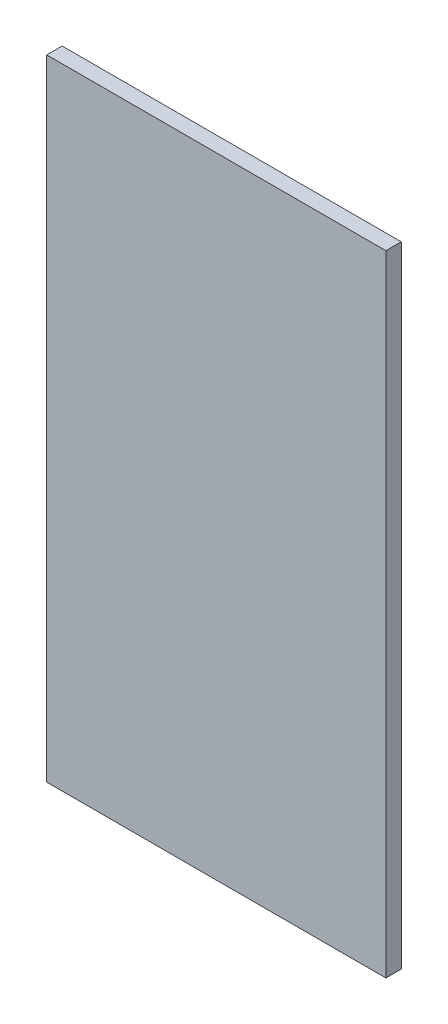
ISO-10303-21;
HEADER;
FILE_DESCRIPTION(('STEP AP214'),'2;1');
FILE_NAME('part.step','',(''),(''),'','','');
FILE_SCHEMA(('AUTOMOTIVE_DESIGN { 1 0 10303 214 1 1 1 1 }'));
ENDSEC;
DATA;
#1=APPLICATION_CONTEXT('core data for automotive mechanical design processes');
#2=APPLICATION_PROTOCOL_DEFINITION('international standard','automotive_design',2000,#1);
#3=PRODUCT_CONTEXT('',#1,'mechanical');
#4=PRODUCT('Part','Part','',(#3));
#5=PRODUCT_RELATED_PRODUCT_CATEGORY('part','',(#4));
#6=PRODUCT_DEFINITION_FORMATION('','',#4);
#7=PRODUCT_DEFINITION_CONTEXT('part definition',#1,'design');
#8=PRODUCT_DEFINITION('design','',#6,#7);
#9=PRODUCT_DEFINITION_SHAPE('','',#8);
#10=(LENGTH_UNIT() NAMED_UNIT(*) SI_UNIT(.MILLI.,.METRE.));
#11=(NAMED_UNIT(*) PLANE_ANGLE_UNIT() SI_UNIT($,.RADIAN.));
#12=(NAMED_UNIT(*) SI_UNIT($,.STERADIAN.) SOLID_ANGLE_UNIT());
#13=UNCERTAINTY_MEASURE_WITH_UNIT(LENGTH_MEASURE(1.E-05),#10,'distance_accuracy_value','');
#14=(GEOMETRIC_REPRESENTATION_CONTEXT(3) GLOBAL_UNCERTAINTY_ASSIGNED_CONTEXT((#13)) GLOBAL_UNIT_ASSIGNED_CONTEXT((#10,
#11,#12)) REPRESENTATION_CONTEXT('',''));
#15=CARTESIAN_POINT('',(0.,0.,0.));
#16=DIRECTION('',(0.,0.,1.));
#17=DIRECTION('',(1.,0.,0.));
#18=AXIS2_PLACEMENT_3D('',#15,#16,#17);
#19=CARTESIAN_POINT('',(-50.0000082570696,2.4999990188482,1.5875));
#20=DIRECTION('',(1.,0.,0.));
#21=DIRECTION('',(0.,1.,0.));
#22=AXIS2_PLACEMENT_3D('',#19,#20,#21);
#23=PLANE('',#22);
#24=DIRECTION('',(0.,-1.,0.));
#25=VECTOR('',#24,1.);
#26=CARTESIAN_POINT('',(-50.0000082570696,2.4999990188482,0.));
#27=LINE('',#26,#25);
#28=CARTESIAN_POINT('',(-50.0000082570697,67.4999990188482,0.));
#29=VERTEX_POINT('',#28);
#30=CARTESIAN_POINT('',(-50.0000082570696,2.4999990188482,0.));
#31=VERTEX_POINT('',#30);
#32=EDGE_CURVE('E98',#29,#31,#27,.T.);
#33=ORIENTED_EDGE('',*,*,#32,.T.);
#34=DIRECTION('',(0.,0.,-1.));
#35=VECTOR('',#34,1.);
#36=CARTESIAN_POINT('',(-50.0000082570696,2.4999990188482,1.5875));
#37=LINE('',#36,#35);
#38=CARTESIAN_POINT('',(-50.0000082570696,2.4999990188482,1.5875));
#39=VERTEX_POINT('',#38);
#40=EDGE_CURVE('E11',#39,#31,#37,.T.);
#41=ORIENTED_EDGE('',*,*,#40,.F.);
#42=DIRECTION('',(0.,-1.,0.));
#43=VECTOR('',#42,1.);
#44=CARTESIAN_POINT('',(-50.0000082570696,2.4999990188482,1.5875));
#45=LINE('',#44,#43);
#46=CARTESIAN_POINT('',(-50.0000082570697,67.4999990188482,1.5875));
#47=VERTEX_POINT('',#46);
#48=EDGE_CURVE('E86',#47,#39,#45,.T.);
#49=ORIENTED_EDGE('',*,*,#48,.F.);
#50=DIRECTION('',(0.,0.,-1.));
#51=VECTOR('',#50,1.);
#52=CARTESIAN_POINT('',(-50.0000082570697,67.4999990188482,1.5875));
#53=LINE('',#52,#51);
#54=EDGE_CURVE('E94',#47,#29,#53,.T.);
#55=ORIENTED_EDGE('',*,*,#54,.T.);
#56=EDGE_LOOP('',(#33,#41,#49,#55));
#57=FACE_BOUND('',#56,.T.);
#58=ADVANCED_FACE('F35',(#57),#23,.F.);
#59=CARTESIAN_POINT('',(-50.0000082570696,2.4999990188482,1.5875));
#60=DIRECTION('',(0.,1.,0.));
#61=DIRECTION('',(-1.,0.,0.));
#62=AXIS2_PLACEMENT_3D('',#59,#60,#61);
#63=PLANE('',#62);
#64=DIRECTION('',(1.,0.,0.));
#65=VECTOR('',#64,1.);
#66=CARTESIAN_POINT('',(-50.0000082570696,2.4999990188482,0.));
#67=LINE('',#66,#65);
#68=CARTESIAN_POINT('',(-15.0000082570696,2.4999990188482,0.));
#69=VERTEX_POINT('',#68);
#70=EDGE_CURVE('E90',#31,#69,#67,.T.);
#71=ORIENTED_EDGE('',*,*,#70,.T.);
#72=DIRECTION('',(0.,0.,-1.));
#73=VECTOR('',#72,1.);
#74=CARTESIAN_POINT('',(-15.0000082570696,2.4999990188482,1.5875));
#75=LINE('',#74,#73);
#76=CARTESIAN_POINT('',(-15.0000082570696,2.4999990188482,1.5875));
#77=VERTEX_POINT('',#76);
#78=EDGE_CURVE('E43',#77,#69,#75,.T.);
#79=ORIENTED_EDGE('',*,*,#78,.F.);
#80=DIRECTION('',(1.,0.,0.));
#81=VECTOR('',#80,1.);
#82=CARTESIAN_POINT('',(-50.0000082570696,2.4999990188482,1.5875));
#83=LINE('',#82,#81);
#84=EDGE_CURVE('E81',#39,#77,#83,.T.);
#85=ORIENTED_EDGE('',*,*,#84,.F.);
#86=ORIENTED_EDGE('',*,*,#40,.T.);
#87=EDGE_LOOP('',(#71,#79,#85,#86));
#88=FACE_BOUND('',#87,.T.);
#89=ADVANCED_FACE('F89',(#88),#63,.F.);
#90=CARTESIAN_POINT('',(-15.0000082570696,2.4999990188482,1.5875));
#91=DIRECTION('',(-1.,0.,0.));
#92=DIRECTION('',(0.,-1.,0.));
#93=AXIS2_PLACEMENT_3D('',#90,#91,#92);
#94=PLANE('',#93);
#95=DIRECTION('',(0.,1.,0.));
#96=VECTOR('',#95,1.);
#97=CARTESIAN_POINT('',(-15.0000082570696,2.4999990188482,0.));
#98=LINE('',#97,#96);
#99=CARTESIAN_POINT('',(-15.0000082570696,67.4999990188482,0.));
#100=VERTEX_POINT('',#99);
#101=EDGE_CURVE('E68',#69,#100,#98,.T.);
#102=ORIENTED_EDGE('',*,*,#101,.T.);
#103=DIRECTION('',(0.,0.,-1.));
#104=VECTOR('',#103,1.);
#105=CARTESIAN_POINT('',(-15.0000082570696,67.4999990188482,1.5875));
#106=LINE('',#105,#104);
#107=CARTESIAN_POINT('',(-15.0000082570696,67.4999990188482,1.5875));
#108=VERTEX_POINT('',#107);
#109=EDGE_CURVE('E91',#108,#100,#106,.T.);
#110=ORIENTED_EDGE('',*,*,#109,.F.);
#111=DIRECTION('',(0.,1.,0.));
#112=VECTOR('',#111,1.);
#113=CARTESIAN_POINT('',(-15.0000082570696,2.4999990188482,1.5875));
#114=LINE('',#113,#112);
#115=EDGE_CURVE('E84',#77,#108,#114,.T.);
#116=ORIENTED_EDGE('',*,*,#115,.F.);
#117=ORIENTED_EDGE('',*,*,#78,.T.);
#118=EDGE_LOOP('',(#102,#110,#116,#117));
#119=FACE_BOUND('',#118,.T.);
#120=ADVANCED_FACE('F92',(#119),#94,.F.);
#121=CARTESIAN_POINT('',(-50.0000082570697,67.4999990188482,1.5875));
#122=DIRECTION('',(0.,-1.,0.));
#123=DIRECTION('',(0.,0.,-1.));
#124=AXIS2_PLACEMENT_3D('',#121,#122,#123);
#125=PLANE('',#124);
#126=DIRECTION('',(-1.,0.,0.));
#127=VECTOR('',#126,1.);
#128=CARTESIAN_POINT('',(-50.0000082570697,67.4999990188482,0.));
#129=LINE('',#128,#127);
#130=EDGE_CURVE('E74',#100,#29,#129,.T.);
#131=ORIENTED_EDGE('',*,*,#130,.T.);
#132=ORIENTED_EDGE('',*,*,#54,.F.);
#133=DIRECTION('',(-1.,0.,0.));
#134=VECTOR('',#133,1.);
#135=CARTESIAN_POINT('',(-50.0000082570697,67.4999990188482,1.5875));
#136=LINE('',#135,#134);
#137=EDGE_CURVE('E51',#108,#47,#136,.T.);
#138=ORIENTED_EDGE('',*,*,#137,.F.);
#139=ORIENTED_EDGE('',*,*,#109,.T.);
#140=EDGE_LOOP('',(#131,#132,#138,#139));
#141=FACE_BOUND('',#140,.T.);
#142=ADVANCED_FACE('F105',(#141),#125,.F.);
#143=CARTESIAN_POINT('',(0.,0.,1.5875));
#144=DIRECTION('',(0.,0.,-1.));
#145=DIRECTION('',(-1.,0.,0.));
#146=AXIS2_PLACEMENT_3D('',#143,#144,#145);
#147=PLANE('',#146);
#148=ORIENTED_EDGE('',*,*,#48,.T.);
#149=ORIENTED_EDGE('',*,*,#84,.T.);
#150=ORIENTED_EDGE('',*,*,#115,.T.);
#151=ORIENTED_EDGE('',*,*,#137,.T.);
#152=EDGE_LOOP('',(#148,#149,#150,#151));
#153=FACE_BOUND('',#152,.T.);
#154=ADVANCED_FACE('F82',(#153),#147,.F.);
#155=CARTESIAN_POINT('',(0.,0.,0.));
#156=DIRECTION('',(0.,0.,-1.));
#157=DIRECTION('',(-1.,0.,0.));
#158=AXIS2_PLACEMENT_3D('',#155,#156,#157);
#159=PLANE('',#158);
#160=ORIENTED_EDGE('',*,*,#32,.F.);
#161=ORIENTED_EDGE('',*,*,#130,.F.);
#162=ORIENTED_EDGE('',*,*,#101,.F.);
#163=ORIENTED_EDGE('',*,*,#70,.F.);
#164=EDGE_LOOP('',(#160,#161,#162,#163));
#165=FACE_BOUND('',#164,.T.);
#166=ADVANCED_FACE('F108',(#165),#159,.T.);
#167=CLOSED_SHELL('',(#58,#89,#120,#142,#154,#166));
#168=MANIFOLD_SOLID_BREP('B2',#167);
#169=ADVANCED_BREP_SHAPE_REPRESENTATION('',(#18,#168),#14);
#170=SHAPE_DEFINITION_REPRESENTATION(#9,#169);
ENDSEC;
END-ISO-10303-21;
